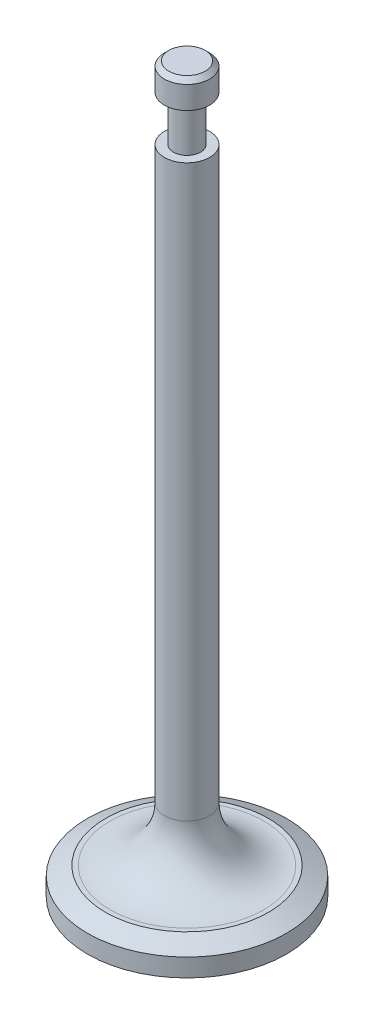
ISO-10303-21;
HEADER;
FILE_DESCRIPTION(('STEP AP214'),'2;1');
FILE_NAME('part.step','',(''),(''),'','','');
FILE_SCHEMA(('AUTOMOTIVE_DESIGN { 1 0 10303 214 1 1 1 1 }'));
ENDSEC;
DATA;
#1=APPLICATION_CONTEXT('core data for automotive mechanical design processes');
#2=APPLICATION_PROTOCOL_DEFINITION('international standard','automotive_design',2000,#1);
#3=PRODUCT_CONTEXT('',#1,'mechanical');
#4=PRODUCT('Part','Part','',(#3));
#5=PRODUCT_RELATED_PRODUCT_CATEGORY('part','',(#4));
#6=PRODUCT_DEFINITION_FORMATION('','',#4);
#7=PRODUCT_DEFINITION_CONTEXT('part definition',#1,'design');
#8=PRODUCT_DEFINITION('design','',#6,#7);
#9=PRODUCT_DEFINITION_SHAPE('','',#8);
#10=(LENGTH_UNIT() NAMED_UNIT(*) SI_UNIT(.MILLI.,.METRE.));
#11=(NAMED_UNIT(*) PLANE_ANGLE_UNIT() SI_UNIT($,.RADIAN.));
#12=(NAMED_UNIT(*) SI_UNIT($,.STERADIAN.) SOLID_ANGLE_UNIT());
#13=UNCERTAINTY_MEASURE_WITH_UNIT(LENGTH_MEASURE(1.E-05),#10,'distance_accuracy_value','');
#14=(GEOMETRIC_REPRESENTATION_CONTEXT(3) GLOBAL_UNCERTAINTY_ASSIGNED_CONTEXT((#13)) GLOBAL_UNIT_ASSIGNED_CONTEXT((#10,
#11,#12)) REPRESENTATION_CONTEXT('',''));
#15=CARTESIAN_POINT('',(0.,0.,0.));
#16=DIRECTION('',(0.,0.,1.));
#17=DIRECTION('',(1.,0.,0.));
#18=AXIS2_PLACEMENT_3D('',#15,#16,#17);
#19=CARTESIAN_POINT('',(11.,0.,0.));
#20=DIRECTION('',(0.,-1.,0.));
#21=DIRECTION('',(0.,0.,-1.));
#22=AXIS2_PLACEMENT_3D('',#19,#20,#21);
#23=PLANE('',#22);
#24=CARTESIAN_POINT('',(0.,0.,0.));
#25=DIRECTION('',(0.,-1.,0.));
#26=DIRECTION('',(0.,0.,-1.));
#27=AXIS2_PLACEMENT_3D('',#24,#25,#26);
#28=CIRCLE('',#27,11.);
#29=CARTESIAN_POINT('',(0.,0.,-11.));
#30=VERTEX_POINT('',#29);
#31=EDGE_CURVE('E77',#30,#30,#28,.T.);
#32=ORIENTED_EDGE('',*,*,#31,.T.);
#33=EDGE_LOOP('',(#32));
#34=FACE_BOUND('',#33,.T.);
#35=ADVANCED_FACE('F41',(#34),#23,.T.);
#36=CARTESIAN_POINT('',(0.,80.,0.));
#37=DIRECTION('',(0.,1.,0.));
#38=DIRECTION('',(0.,0.,1.));
#39=AXIS2_PLACEMENT_3D('',#36,#37,#38);
#40=PLANE('',#39);
#41=CARTESIAN_POINT('',(0.,80.,0.));
#42=DIRECTION('',(0.,1.,0.));
#43=DIRECTION('',(0.,0.,1.));
#44=AXIS2_PLACEMENT_3D('',#41,#42,#43);
#45=CIRCLE('',#44,2.00000000000001);
#46=CARTESIAN_POINT('',(0.,80.,2.00000000000001));
#47=VERTEX_POINT('',#46);
#48=EDGE_CURVE('E52',#47,#47,#45,.T.);
#49=ORIENTED_EDGE('',*,*,#48,.T.);
#50=EDGE_LOOP('',(#49));
#51=FACE_BOUND('',#50,.T.);
#52=ADVANCED_FACE('F101',(#51),#40,.T.);
#53=CARTESIAN_POINT('',(0.,0.,0.));
#54=DIRECTION('',(0.,-1.,0.));
#55=DIRECTION('',(0.,0.,-1.));
#56=AXIS2_PLACEMENT_3D('',#53,#54,#55);
#57=CYLINDRICAL_SURFACE('',#56,2.5);
#58=CARTESIAN_POINT('',(0.,79.5,0.));
#59=DIRECTION('',(0.,1.,0.));
#60=DIRECTION('',(0.,0.,1.));
#61=AXIS2_PLACEMENT_3D('',#58,#59,#60);
#62=CIRCLE('',#61,2.5);
#63=CARTESIAN_POINT('',(0.,79.5,2.5));
#64=VERTEX_POINT('',#63);
#65=EDGE_CURVE('E60',#64,#64,#62,.F.);
#66=ORIENTED_EDGE('',*,*,#65,.T.);
#67=EDGE_LOOP('',(#66));
#68=FACE_BOUND('',#67,.T.);
#69=CARTESIAN_POINT('',(0.,77.,0.));
#70=DIRECTION('',(0.,-1.,0.));
#71=DIRECTION('',(0.,0.,-1.));
#72=AXIS2_PLACEMENT_3D('',#69,#70,#71);
#73=CIRCLE('',#72,2.5);
#74=CARTESIAN_POINT('',(0.,77.,-2.5));
#75=VERTEX_POINT('',#74);
#76=EDGE_CURVE('E69',#75,#75,#73,.T.);
#77=ORIENTED_EDGE('',*,*,#76,.F.);
#78=EDGE_LOOP('',(#77));
#79=FACE_BOUND('',#78,.T.);
#80=ADVANCED_FACE('F110',(#68,#79),#57,.T.);
#81=CARTESIAN_POINT('',(2.5,77.,0.));
#82=DIRECTION('',(0.,-1.,0.));
#83=DIRECTION('',(0.,0.,-1.));
#84=AXIS2_PLACEMENT_3D('',#81,#82,#83);
#85=PLANE('',#84);
#86=ORIENTED_EDGE('',*,*,#76,.T.);
#87=EDGE_LOOP('',(#86));
#88=FACE_BOUND('',#87,.T.);
#89=CARTESIAN_POINT('',(0.,77.,0.));
#90=DIRECTION('',(0.,-1.,0.));
#91=DIRECTION('',(0.,0.,-1.));
#92=AXIS2_PLACEMENT_3D('',#89,#90,#91);
#93=CIRCLE('',#92,1.5);
#94=CARTESIAN_POINT('',(0.,77.,-1.5));
#95=VERTEX_POINT('',#94);
#96=EDGE_CURVE('E72',#95,#95,#93,.T.);
#97=ORIENTED_EDGE('',*,*,#96,.F.);
#98=EDGE_LOOP('',(#97));
#99=FACE_BOUND('',#98,.T.);
#100=ADVANCED_FACE('F125',(#88,#99),#85,.T.);
#101=CARTESIAN_POINT('',(0.,0.,0.));
#102=DIRECTION('',(0.,-1.,0.));
#103=DIRECTION('',(0.,0.,-1.));
#104=AXIS2_PLACEMENT_3D('',#101,#102,#103);
#105=CYLINDRICAL_SURFACE('',#104,1.5);
#106=ORIENTED_EDGE('',*,*,#96,.T.);
#107=EDGE_LOOP('',(#106));
#108=FACE_BOUND('',#107,.T.);
#109=CARTESIAN_POINT('',(0.,72.,0.));
#110=DIRECTION('',(0.,-1.,0.));
#111=DIRECTION('',(0.,0.,-1.));
#112=AXIS2_PLACEMENT_3D('',#109,#110,#111);
#113=CIRCLE('',#112,1.5);
#114=CARTESIAN_POINT('',(0.,72.,-1.5));
#115=VERTEX_POINT('',#114);
#116=EDGE_CURVE('E74',#115,#115,#113,.T.);
#117=ORIENTED_EDGE('',*,*,#116,.F.);
#118=EDGE_LOOP('',(#117));
#119=FACE_BOUND('',#118,.T.);
#120=ADVANCED_FACE('F129',(#108,#119),#105,.T.);
#121=CARTESIAN_POINT('',(1.5,72.,0.));
#122=DIRECTION('',(0.,1.,0.));
#123=DIRECTION('',(0.,0.,1.));
#124=AXIS2_PLACEMENT_3D('',#121,#122,#123);
#125=PLANE('',#124);
#126=ORIENTED_EDGE('',*,*,#116,.T.);
#127=EDGE_LOOP('',(#126));
#128=FACE_BOUND('',#127,.T.);
#129=CARTESIAN_POINT('',(0.,72.,0.));
#130=DIRECTION('',(0.,-1.,0.));
#131=DIRECTION('',(0.,0.,-1.));
#132=AXIS2_PLACEMENT_3D('',#129,#130,#131);
#133=CIRCLE('',#132,2.5);
#134=CARTESIAN_POINT('',(0.,72.,-2.5));
#135=VERTEX_POINT('',#134);
#136=EDGE_CURVE('E76',#135,#135,#133,.T.);
#137=ORIENTED_EDGE('',*,*,#136,.F.);
#138=EDGE_LOOP('',(#137));
#139=FACE_BOUND('',#138,.T.);
#140=ADVANCED_FACE('F132',(#128,#139),#125,.T.);
#141=CARTESIAN_POINT('',(0.,0.,0.));
#142=DIRECTION('',(0.,-1.,0.));
#143=DIRECTION('',(0.,0.,-1.));
#144=AXIS2_PLACEMENT_3D('',#141,#142,#143);
#145=CYLINDRICAL_SURFACE('',#144,2.5);
#146=CARTESIAN_POINT('',(0.,9.,0.));
#147=DIRECTION('',(0.,1.,0.));
#148=DIRECTION('',(0.,0.,1.));
#149=AXIS2_PLACEMENT_3D('',#146,#147,#148);
#150=CIRCLE('',#149,2.5);
#151=CARTESIAN_POINT('',(0.,9.,2.5));
#152=VERTEX_POINT('',#151);
#153=EDGE_CURVE('E61',#152,#152,#150,.T.);
#154=ORIENTED_EDGE('',*,*,#153,.T.);
#155=EDGE_LOOP('',(#154));
#156=FACE_BOUND('',#155,.T.);
#157=ORIENTED_EDGE('',*,*,#136,.T.);
#158=EDGE_LOOP('',(#157));
#159=FACE_BOUND('',#158,.T.);
#160=ADVANCED_FACE('F98',(#156,#159),#145,.T.);
#161=CARTESIAN_POINT('',(2.50000000000001,3.,0.));
#162=DIRECTION('',(0.,1.,0.));
#163=DIRECTION('',(0.,0.,1.));
#164=AXIS2_PLACEMENT_3D('',#161,#162,#163);
#165=PLANE('',#164);
#166=CARTESIAN_POINT('',(0.,3.,0.));
#167=DIRECTION('',(0.,1.,0.));
#168=DIRECTION('',(0.,0.,1.));
#169=AXIS2_PLACEMENT_3D('',#166,#167,#168);
#170=CIRCLE('',#169,8.99999999999998);
#171=CARTESIAN_POINT('',(0.,3.,8.99999999999998));
#172=VERTEX_POINT('',#171);
#173=EDGE_CURVE('E10',#172,#172,#170,.T.);
#174=ORIENTED_EDGE('',*,*,#173,.T.);
#175=EDGE_LOOP('',(#174));
#176=FACE_BOUND('',#175,.T.);
#177=CARTESIAN_POINT('',(0.,3.,0.));
#178=DIRECTION('',(0.,1.,0.));
#179=DIRECTION('',(0.,0.,1.));
#180=AXIS2_PLACEMENT_3D('',#177,#178,#179);
#181=CIRCLE('',#180,8.5);
#182=CARTESIAN_POINT('',(0.,3.,8.5));
#183=VERTEX_POINT('',#182);
#184=EDGE_CURVE('E62',#183,#183,#181,.F.);
#185=ORIENTED_EDGE('',*,*,#184,.T.);
#186=EDGE_LOOP('',(#185));
#187=FACE_BOUND('',#186,.T.);
#188=ADVANCED_FACE('F86',(#176,#187),#165,.T.);
#189=CARTESIAN_POINT('',(0.,0.,0.));
#190=DIRECTION('',(0.,-1.,0.));
#191=DIRECTION('',(0.,0.,-1.));
#192=AXIS2_PLACEMENT_3D('',#189,#190,#191);
#193=CYLINDRICAL_SURFACE('',#192,11.);
#194=CARTESIAN_POINT('',(0.,1.99999999999999,0.));
#195=DIRECTION('',(0.,1.,0.));
#196=DIRECTION('',(0.,0.,1.));
#197=AXIS2_PLACEMENT_3D('',#194,#195,#196);
#198=CIRCLE('',#197,11.);
#199=CARTESIAN_POINT('',(0.,1.99999999999999,11.));
#200=VERTEX_POINT('',#199);
#201=EDGE_CURVE('E47',#200,#200,#198,.F.);
#202=ORIENTED_EDGE('',*,*,#201,.T.);
#203=EDGE_LOOP('',(#202));
#204=FACE_BOUND('',#203,.T.);
#205=ORIENTED_EDGE('',*,*,#31,.F.);
#206=EDGE_LOOP('',(#205));
#207=FACE_BOUND('',#206,.T.);
#208=ADVANCED_FACE('F85',(#204,#207),#193,.T.);
#209=CARTESIAN_POINT('',(0.,9.,0.));
#210=DIRECTION('',(0.,1.,0.));
#211=DIRECTION('',(0.,0.,1.));
#212=AXIS2_PLACEMENT_3D('',#209,#210,#211);
#213=TOROIDAL_SURFACE('',#212,8.5,6.);
#214=ORIENTED_EDGE('',*,*,#153,.F.);
#215=EDGE_LOOP('',(#214));
#216=FACE_BOUND('',#215,.T.);
#217=ORIENTED_EDGE('',*,*,#184,.F.);
#218=EDGE_LOOP('',(#217));
#219=FACE_BOUND('',#218,.T.);
#220=ADVANCED_FACE('F87',(#216,#219),#213,.F.);
#221=CARTESIAN_POINT('',(0.,79.5,0.));
#222=DIRECTION('',(0.,-1.,0.));
#223=DIRECTION('',(0.,0.,-1.));
#224=AXIS2_PLACEMENT_3D('',#221,#222,#223);
#225=CONICAL_SURFACE('',#224,2.5,0.785398163397453);
#226=ORIENTED_EDGE('',*,*,#48,.F.);
#227=EDGE_LOOP('',(#226));
#228=FACE_BOUND('',#227,.T.);
#229=ORIENTED_EDGE('',*,*,#65,.F.);
#230=EDGE_LOOP('',(#229));
#231=FACE_BOUND('',#230,.T.);
#232=ADVANCED_FACE('F92',(#228,#231),#225,.T.);
#233=CARTESIAN_POINT('',(0.,1.99999999999999,0.));
#234=DIRECTION('',(0.,-1.,0.));
#235=DIRECTION('',(0.,0.,-1.));
#236=AXIS2_PLACEMENT_3D('',#233,#234,#235);
#237=CONICAL_SURFACE('',#236,11.,1.10714871779409);
#238=ORIENTED_EDGE('',*,*,#173,.F.);
#239=EDGE_LOOP('',(#238));
#240=FACE_BOUND('',#239,.T.);
#241=ORIENTED_EDGE('',*,*,#201,.F.);
#242=EDGE_LOOP('',(#241));
#243=FACE_BOUND('',#242,.T.);
#244=ADVANCED_FACE('F42',(#240,#243),#237,.T.);
#245=CLOSED_SHELL('',(#35,#52,#80,#100,#120,#140,#160,#188,#208,#220,#232,#244));
#246=MANIFOLD_SOLID_BREP('B2',#245);
#247=ADVANCED_BREP_SHAPE_REPRESENTATION('',(#18,#246),#14);
#248=SHAPE_DEFINITION_REPRESENTATION(#9,#247);
ENDSEC;
END-ISO-10303-21;
